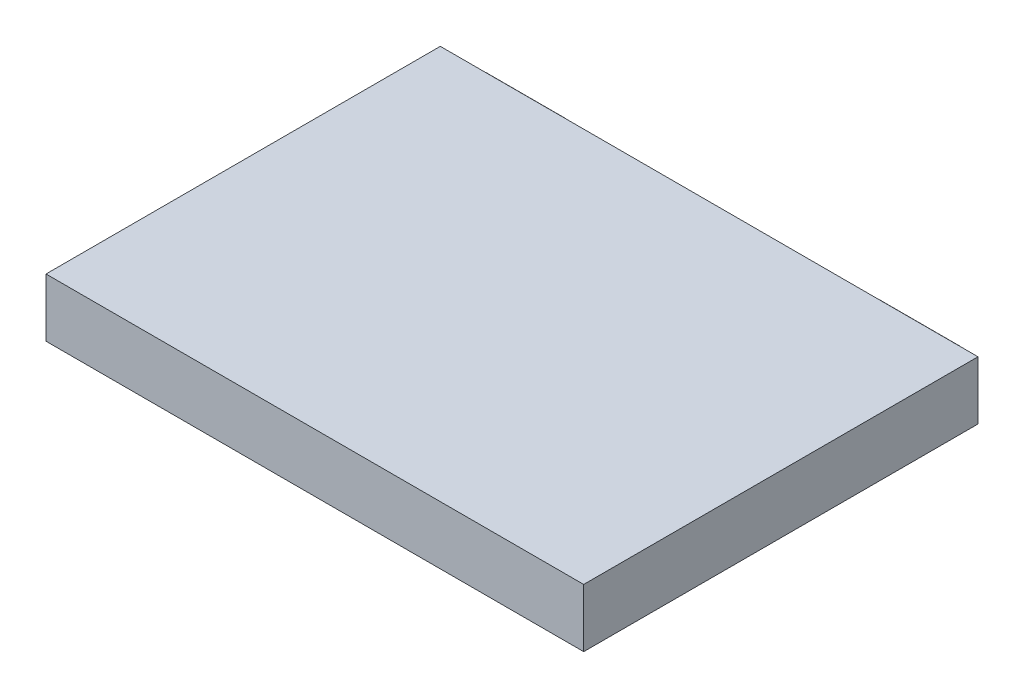
ISO-10303-21;
HEADER;
FILE_DESCRIPTION(('STEP AP214'),'2;1');
FILE_NAME('part.step','',(''),(''),'','','');
FILE_SCHEMA(('AUTOMOTIVE_DESIGN { 1 0 10303 214 1 1 1 1 }'));
ENDSEC;
DATA;
#1=APPLICATION_CONTEXT('core data for automotive mechanical design processes');
#2=APPLICATION_PROTOCOL_DEFINITION('international standard','automotive_design',2000,#1);
#3=PRODUCT_CONTEXT('',#1,'mechanical');
#4=PRODUCT('Part','Part','',(#3));
#5=PRODUCT_RELATED_PRODUCT_CATEGORY('part','',(#4));
#6=PRODUCT_DEFINITION_FORMATION('','',#4);
#7=PRODUCT_DEFINITION_CONTEXT('part definition',#1,'design');
#8=PRODUCT_DEFINITION('design','',#6,#7);
#9=PRODUCT_DEFINITION_SHAPE('','',#8);
#10=(LENGTH_UNIT() NAMED_UNIT(*) SI_UNIT(.MILLI.,.METRE.));
#11=(NAMED_UNIT(*) PLANE_ANGLE_UNIT() SI_UNIT($,.RADIAN.));
#12=(NAMED_UNIT(*) SI_UNIT($,.STERADIAN.) SOLID_ANGLE_UNIT());
#13=UNCERTAINTY_MEASURE_WITH_UNIT(LENGTH_MEASURE(1.E-05),#10,'distance_accuracy_value','');
#14=(GEOMETRIC_REPRESENTATION_CONTEXT(3) GLOBAL_UNCERTAINTY_ASSIGNED_CONTEXT((#13)) GLOBAL_UNIT_ASSIGNED_CONTEXT((#10,
#11,#12)) REPRESENTATION_CONTEXT('',''));
#15=CARTESIAN_POINT('',(0.,0.,0.));
#16=DIRECTION('',(0.,0.,1.));
#17=DIRECTION('',(1.,0.,0.));
#18=AXIS2_PLACEMENT_3D('',#15,#16,#17);
#19=CARTESIAN_POINT('',(60.,13.,-44.));
#20=DIRECTION('',(-1.,0.,0.));
#21=DIRECTION('',(0.,0.,1.));
#22=AXIS2_PLACEMENT_3D('',#19,#20,#21);
#23=PLANE('',#22);
#24=DIRECTION('',(0.,0.,-1.));
#25=VECTOR('',#24,1.);
#26=CARTESIAN_POINT('',(60.,0.,-44.));
#27=LINE('',#26,#25);
#28=CARTESIAN_POINT('',(60.,0.,44.));
#29=VERTEX_POINT('',#28);
#30=CARTESIAN_POINT('',(60.,0.,-44.));
#31=VERTEX_POINT('',#30);
#32=EDGE_CURVE('E195',#29,#31,#27,.T.);
#33=ORIENTED_EDGE('',*,*,#32,.T.);
#34=DIRECTION('',(0.,-1.,0.));
#35=VECTOR('',#34,1.);
#36=CARTESIAN_POINT('',(60.,13.,-44.));
#37=LINE('',#36,#35);
#38=CARTESIAN_POINT('',(60.,13.,-44.));
#39=VERTEX_POINT('',#38);
#40=EDGE_CURVE('E11',#39,#31,#37,.T.);
#41=ORIENTED_EDGE('',*,*,#40,.F.);
#42=DIRECTION('',(0.,0.,-1.));
#43=VECTOR('',#42,1.);
#44=CARTESIAN_POINT('',(60.,13.,-44.));
#45=LINE('',#44,#43);
#46=CARTESIAN_POINT('',(60.,13.,44.));
#47=VERTEX_POINT('',#46);
#48=EDGE_CURVE('E196',#47,#39,#45,.T.);
#49=ORIENTED_EDGE('',*,*,#48,.F.);
#50=DIRECTION('',(0.,-1.,0.));
#51=VECTOR('',#50,1.);
#52=CARTESIAN_POINT('',(60.,13.,44.));
#53=LINE('',#52,#51);
#54=EDGE_CURVE('E206',#47,#29,#53,.T.);
#55=ORIENTED_EDGE('',*,*,#54,.T.);
#56=EDGE_LOOP('',(#33,#41,#49,#55));
#57=FACE_BOUND('',#56,.T.);
#58=ADVANCED_FACE('F37',(#57),#23,.F.);
#59=CARTESIAN_POINT('',(-60.,13.,-44.));
#60=DIRECTION('',(0.,0.,1.));
#61=DIRECTION('',(1.,0.,0.));
#62=AXIS2_PLACEMENT_3D('',#59,#60,#61);
#63=PLANE('',#62);
#64=DIRECTION('',(1.,0.,0.));
#65=VECTOR('',#64,1.);
#66=CARTESIAN_POINT('',(0.,10.0368341750979,-44.));
#67=LINE('',#66,#65);
#68=CARTESIAN_POINT('',(-52.87689989644,10.0368341750977,-44.));
#69=VERTEX_POINT('',#68);
#70=CARTESIAN_POINT('',(-35.12310010356,10.0368341750977,-44.));
#71=VERTEX_POINT('',#70);
#72=EDGE_CURVE('E159',#69,#71,#67,.T.);
#73=ORIENTED_EDGE('',*,*,#72,.F.);
#74=DIRECTION('',(0.,-1.,0.));
#75=VECTOR('',#74,1.);
#76=CARTESIAN_POINT('',(-52.87689989644,-2.41637953996677E-13,-44.));
#77=LINE('',#76,#75);
#78=CARTESIAN_POINT('',(-52.87689989644,3.96316582490187,-44.));
#79=VERTEX_POINT('',#78);
#80=EDGE_CURVE('E134',#69,#79,#77,.T.);
#81=ORIENTED_EDGE('',*,*,#80,.T.);
#82=DIRECTION('',(1.,0.,0.));
#83=VECTOR('',#82,1.);
#84=CARTESIAN_POINT('',(0.,3.9631658249021,-44.));
#85=LINE('',#84,#83);
#86=CARTESIAN_POINT('',(-35.12310010356,3.96316582490195,-44.));
#87=VERTEX_POINT('',#86);
#88=EDGE_CURVE('E150',#79,#87,#85,.T.);
#89=ORIENTED_EDGE('',*,*,#88,.T.);
#90=DIRECTION('',(0.,-1.,0.));
#91=VECTOR('',#90,1.);
#92=CARTESIAN_POINT('',(-35.12310010356,-1.60506271427915E-13,-44.));
#93=LINE('',#92,#91);
#94=EDGE_CURVE('E51',#71,#87,#93,.T.);
#95=ORIENTED_EDGE('',*,*,#94,.F.);
#96=EDGE_LOOP('',(#73,#81,#89,#95));
#97=FACE_BOUND('',#96,.T.);
#98=DIRECTION('',(-1.,0.,0.));
#99=VECTOR('',#98,1.);
#100=CARTESIAN_POINT('',(0.,10.0368341750979,-44.));
#101=LINE('',#100,#99);
#102=CARTESIAN_POINT('',(52.87689989644,10.0368341750979,-44.));
#103=VERTEX_POINT('',#102);
#104=CARTESIAN_POINT('',(35.12310010356,10.0368341750979,-44.));
#105=VERTEX_POINT('',#104);
#106=EDGE_CURVE('E59',#103,#105,#101,.T.);
#107=ORIENTED_EDGE('',*,*,#106,.T.);
#108=DIRECTION('',(0.,-1.,0.));
#109=VECTOR('',#108,1.);
#110=CARTESIAN_POINT('',(35.12310010356,0.,-44.));
#111=LINE('',#110,#109);
#112=CARTESIAN_POINT('',(35.12310010356,3.9631658249021,-44.));
#113=VERTEX_POINT('',#112);
#114=EDGE_CURVE('E137',#105,#113,#111,.T.);
#115=ORIENTED_EDGE('',*,*,#114,.T.);
#116=DIRECTION('',(-1.,0.,0.));
#117=VECTOR('',#116,1.);
#118=CARTESIAN_POINT('',(0.,3.9631658249021,-44.));
#119=LINE('',#118,#117);
#120=CARTESIAN_POINT('',(52.87689989644,3.9631658249021,-44.));
#121=VERTEX_POINT('',#120);
#122=EDGE_CURVE('E170',#121,#113,#119,.T.);
#123=ORIENTED_EDGE('',*,*,#122,.F.);
#124=DIRECTION('',(0.,-1.,0.));
#125=VECTOR('',#124,1.);
#126=CARTESIAN_POINT('',(52.87689989644,0.,-44.));
#127=LINE('',#126,#125);
#128=EDGE_CURVE('E180',#103,#121,#127,.T.);
#129=ORIENTED_EDGE('',*,*,#128,.F.);
#130=EDGE_LOOP('',(#107,#115,#123,#129));
#131=FACE_BOUND('',#130,.T.);
#132=DIRECTION('',(-1.,0.,0.));
#133=VECTOR('',#132,1.);
#134=CARTESIAN_POINT('',(-60.,0.,-44.));
#135=LINE('',#134,#133);
#136=CARTESIAN_POINT('',(-60.,0.,-44.));
#137=VERTEX_POINT('',#136);
#138=EDGE_CURVE('E209',#31,#137,#135,.T.);
#139=ORIENTED_EDGE('',*,*,#138,.T.);
#140=DIRECTION('',(0.,-1.,0.));
#141=VECTOR('',#140,1.);
#142=CARTESIAN_POINT('',(-60.,13.,-44.));
#143=LINE('',#142,#141);
#144=CARTESIAN_POINT('',(-60.,13.,-44.));
#145=VERTEX_POINT('',#144);
#146=EDGE_CURVE('E44',#145,#137,#143,.T.);
#147=ORIENTED_EDGE('',*,*,#146,.F.);
#148=DIRECTION('',(-1.,0.,0.));
#149=VECTOR('',#148,1.);
#150=CARTESIAN_POINT('',(-60.,13.,-44.));
#151=LINE('',#150,#149);
#152=EDGE_CURVE('E199',#39,#145,#151,.T.);
#153=ORIENTED_EDGE('',*,*,#152,.F.);
#154=ORIENTED_EDGE('',*,*,#40,.T.);
#155=EDGE_LOOP('',(#139,#147,#153,#154));
#156=FACE_BOUND('',#155,.T.);
#157=ADVANCED_FACE('F239',(#97,#131,#156),#63,.F.);
#158=CARTESIAN_POINT('',(-60.,13.,-44.));
#159=DIRECTION('',(1.,0.,0.));
#160=DIRECTION('',(0.,0.,-1.));
#161=AXIS2_PLACEMENT_3D('',#158,#159,#160);
#162=PLANE('',#161);
#163=DIRECTION('',(0.,0.,1.));
#164=VECTOR('',#163,1.);
#165=CARTESIAN_POINT('',(-60.,0.,-44.));
#166=LINE('',#165,#164);
#167=CARTESIAN_POINT('',(-60.,0.,44.));
#168=VERTEX_POINT('',#167);
#169=EDGE_CURVE('E211',#137,#168,#166,.T.);
#170=ORIENTED_EDGE('',*,*,#169,.T.);
#171=DIRECTION('',(0.,-1.,0.));
#172=VECTOR('',#171,1.);
#173=CARTESIAN_POINT('',(-60.,13.,44.));
#174=LINE('',#173,#172);
#175=CARTESIAN_POINT('',(-60.,13.,44.));
#176=VERTEX_POINT('',#175);
#177=EDGE_CURVE('E216',#176,#168,#174,.T.);
#178=ORIENTED_EDGE('',*,*,#177,.F.);
#179=DIRECTION('',(0.,0.,1.));
#180=VECTOR('',#179,1.);
#181=CARTESIAN_POINT('',(-60.,13.,-44.));
#182=LINE('',#181,#180);
#183=EDGE_CURVE('E202',#145,#176,#182,.T.);
#184=ORIENTED_EDGE('',*,*,#183,.F.);
#185=ORIENTED_EDGE('',*,*,#146,.T.);
#186=EDGE_LOOP('',(#170,#178,#184,#185));
#187=FACE_BOUND('',#186,.T.);
#188=ADVANCED_FACE('F223',(#187),#162,.F.);
#189=CARTESIAN_POINT('',(-60.,13.,44.));
#190=DIRECTION('',(0.,0.,-1.));
#191=DIRECTION('',(-1.,0.,0.));
#192=AXIS2_PLACEMENT_3D('',#189,#190,#191);
#193=PLANE('',#192);
#194=DIRECTION('',(1.,0.,0.));
#195=VECTOR('',#194,1.);
#196=CARTESIAN_POINT('',(-60.,0.,44.));
#197=LINE('',#196,#195);
#198=EDGE_CURVE('E200',#168,#29,#197,.T.);
#199=ORIENTED_EDGE('',*,*,#198,.T.);
#200=ORIENTED_EDGE('',*,*,#54,.F.);
#201=DIRECTION('',(1.,0.,0.));
#202=VECTOR('',#201,1.);
#203=CARTESIAN_POINT('',(-60.,13.,44.));
#204=LINE('',#203,#202);
#205=EDGE_CURVE('E204',#176,#47,#204,.T.);
#206=ORIENTED_EDGE('',*,*,#205,.F.);
#207=ORIENTED_EDGE('',*,*,#177,.T.);
#208=EDGE_LOOP('',(#199,#200,#206,#207));
#209=FACE_BOUND('',#208,.T.);
#210=ADVANCED_FACE('F232',(#209),#193,.F.);
#211=CARTESIAN_POINT('',(0.,13.,0.));
#212=DIRECTION('',(0.,1.,0.));
#213=DIRECTION('',(0.,0.,1.));
#214=AXIS2_PLACEMENT_3D('',#211,#212,#213);
#215=PLANE('',#214);
#216=ORIENTED_EDGE('',*,*,#48,.T.);
#217=ORIENTED_EDGE('',*,*,#152,.T.);
#218=ORIENTED_EDGE('',*,*,#183,.T.);
#219=ORIENTED_EDGE('',*,*,#205,.T.);
#220=EDGE_LOOP('',(#216,#217,#218,#219));
#221=FACE_BOUND('',#220,.T.);
#222=ADVANCED_FACE('F238',(#221),#215,.T.);
#223=CARTESIAN_POINT('',(0.,0.,0.));
#224=DIRECTION('',(0.,1.,0.));
#225=DIRECTION('',(0.,0.,1.));
#226=AXIS2_PLACEMENT_3D('',#223,#224,#225);
#227=PLANE('',#226);
#228=ORIENTED_EDGE('',*,*,#32,.F.);
#229=ORIENTED_EDGE('',*,*,#198,.F.);
#230=ORIENTED_EDGE('',*,*,#169,.F.);
#231=ORIENTED_EDGE('',*,*,#138,.F.);
#232=EDGE_LOOP('',(#228,#229,#230,#231));
#233=FACE_BOUND('',#232,.T.);
#234=ADVANCED_FACE('F229',(#233),#227,.F.);
#235=CARTESIAN_POINT('',(35.12310010356,0.,-47.));
#236=DIRECTION('',(-1.,0.,0.));
#237=DIRECTION('',(0.,0.,1.));
#238=AXIS2_PLACEMENT_3D('',#235,#236,#237);
#239=PLANE('',#238);
#240=ORIENTED_EDGE('',*,*,#114,.F.);
#241=DIRECTION('',(0.,0.,1.));
#242=VECTOR('',#241,1.);
#243=CARTESIAN_POINT('',(35.12310010356,10.0368341750979,-47.));
#244=LINE('',#243,#242);
#245=CARTESIAN_POINT('',(35.12310010356,10.0368341750979,-47.));
#246=VERTEX_POINT('',#245);
#247=EDGE_CURVE('E193',#246,#105,#244,.T.);
#248=ORIENTED_EDGE('',*,*,#247,.F.);
#249=DIRECTION('',(0.,-1.,0.));
#250=VECTOR('',#249,1.);
#251=CARTESIAN_POINT('',(35.12310010356,0.,-47.));
#252=LINE('',#251,#250);
#253=CARTESIAN_POINT('',(35.12310010356,3.9631658249021,-47.));
#254=VERTEX_POINT('',#253);
#255=EDGE_CURVE('E166',#246,#254,#252,.T.);
#256=ORIENTED_EDGE('',*,*,#255,.T.);
#257=DIRECTION('',(0.,0.,1.));
#258=VECTOR('',#257,1.);
#259=CARTESIAN_POINT('',(35.12310010356,3.9631658249021,-47.));
#260=LINE('',#259,#258);
#261=EDGE_CURVE('E177',#254,#113,#260,.T.);
#262=ORIENTED_EDGE('',*,*,#261,.T.);
#263=EDGE_LOOP('',(#240,#248,#256,#262));
#264=FACE_BOUND('',#263,.T.);
#265=ADVANCED_FACE('F252',(#264),#239,.T.);
#266=CARTESIAN_POINT('',(0.,10.0368341750979,-47.));
#267=DIRECTION('',(0.,1.,0.));
#268=DIRECTION('',(0.,0.,1.));
#269=AXIS2_PLACEMENT_3D('',#266,#267,#268);
#270=PLANE('',#269);
#271=ORIENTED_EDGE('',*,*,#106,.F.);
#272=DIRECTION('',(0.,0.,1.));
#273=VECTOR('',#272,1.);
#274=CARTESIAN_POINT('',(52.87689989644,10.0368341750979,-47.));
#275=LINE('',#274,#273);
#276=CARTESIAN_POINT('',(52.87689989644,10.0368341750979,-47.));
#277=VERTEX_POINT('',#276);
#278=EDGE_CURVE('E190',#277,#103,#275,.T.);
#279=ORIENTED_EDGE('',*,*,#278,.F.);
#280=DIRECTION('',(-1.,0.,0.));
#281=VECTOR('',#280,1.);
#282=CARTESIAN_POINT('',(0.,10.0368341750979,-47.));
#283=LINE('',#282,#281);
#284=EDGE_CURVE('E169',#277,#246,#283,.T.);
#285=ORIENTED_EDGE('',*,*,#284,.T.);
#286=ORIENTED_EDGE('',*,*,#247,.T.);
#287=EDGE_LOOP('',(#271,#279,#285,#286));
#288=FACE_BOUND('',#287,.T.);
#289=ADVANCED_FACE('F257',(#288),#270,.T.);
#290=CARTESIAN_POINT('',(52.87689989644,0.,-47.));
#291=DIRECTION('',(-1.,0.,0.));
#292=DIRECTION('',(0.,0.,1.));
#293=AXIS2_PLACEMENT_3D('',#290,#291,#292);
#294=PLANE('',#293);
#295=ORIENTED_EDGE('',*,*,#128,.T.);
#296=DIRECTION('',(0.,0.,1.));
#297=VECTOR('',#296,1.);
#298=CARTESIAN_POINT('',(52.87689989644,3.9631658249021,-47.));
#299=LINE('',#298,#297);
#300=CARTESIAN_POINT('',(52.87689989644,3.9631658249021,-47.));
#301=VERTEX_POINT('',#300);
#302=EDGE_CURVE('E187',#301,#121,#299,.T.);
#303=ORIENTED_EDGE('',*,*,#302,.F.);
#304=DIRECTION('',(0.,-1.,0.));
#305=VECTOR('',#304,1.);
#306=CARTESIAN_POINT('',(52.87689989644,0.,-47.));
#307=LINE('',#306,#305);
#308=EDGE_CURVE('E173',#277,#301,#307,.T.);
#309=ORIENTED_EDGE('',*,*,#308,.F.);
#310=ORIENTED_EDGE('',*,*,#278,.T.);
#311=EDGE_LOOP('',(#295,#303,#309,#310));
#312=FACE_BOUND('',#311,.T.);
#313=ADVANCED_FACE('F261',(#312),#294,.F.);
#314=CARTESIAN_POINT('',(0.,3.9631658249021,-47.));
#315=DIRECTION('',(0.,1.,0.));
#316=DIRECTION('',(0.,0.,1.));
#317=AXIS2_PLACEMENT_3D('',#314,#315,#316);
#318=PLANE('',#317);
#319=ORIENTED_EDGE('',*,*,#122,.T.);
#320=ORIENTED_EDGE('',*,*,#261,.F.);
#321=DIRECTION('',(-1.,0.,0.));
#322=VECTOR('',#321,1.);
#323=CARTESIAN_POINT('',(0.,3.9631658249021,-47.));
#324=LINE('',#323,#322);
#325=EDGE_CURVE('E175',#301,#254,#324,.T.);
#326=ORIENTED_EDGE('',*,*,#325,.F.);
#327=ORIENTED_EDGE('',*,*,#302,.T.);
#328=EDGE_LOOP('',(#319,#320,#326,#327));
#329=FACE_BOUND('',#328,.T.);
#330=ADVANCED_FACE('F265',(#329),#318,.F.);
#331=CARTESIAN_POINT('',(0.,0.,-47.));
#332=DIRECTION('',(0.,0.,-1.));
#333=DIRECTION('',(-1.,0.,0.));
#334=AXIS2_PLACEMENT_3D('',#331,#332,#333);
#335=PLANE('',#334);
#336=ORIENTED_EDGE('',*,*,#255,.F.);
#337=ORIENTED_EDGE('',*,*,#284,.F.);
#338=ORIENTED_EDGE('',*,*,#308,.T.);
#339=ORIENTED_EDGE('',*,*,#325,.T.);
#340=EDGE_LOOP('',(#336,#337,#338,#339));
#341=FACE_BOUND('',#340,.T.);
#342=ADVANCED_FACE('F269',(#341),#335,.T.);
#343=CARTESIAN_POINT('',(-52.87689989644,-2.41637953996677E-13,-47.));
#344=DIRECTION('',(-1.,0.,0.));
#345=DIRECTION('',(0.,-1.,0.));
#346=AXIS2_PLACEMENT_3D('',#343,#344,#345);
#347=PLANE('',#346);
#348=ORIENTED_EDGE('',*,*,#80,.F.);
#349=DIRECTION('',(0.,0.,1.));
#350=VECTOR('',#349,1.);
#351=CARTESIAN_POINT('',(-52.87689989644,10.0368341750977,-47.));
#352=LINE('',#351,#350);
#353=CARTESIAN_POINT('',(-52.87689989644,10.0368341750977,-47.));
#354=VERTEX_POINT('',#353);
#355=EDGE_CURVE('E127',#354,#69,#352,.T.);
#356=ORIENTED_EDGE('',*,*,#355,.F.);
#357=DIRECTION('',(0.,-1.,0.));
#358=VECTOR('',#357,1.);
#359=CARTESIAN_POINT('',(-52.87689989644,-2.41637953996677E-13,-47.));
#360=LINE('',#359,#358);
#361=CARTESIAN_POINT('',(-52.87689989644,3.96316582490187,-47.));
#362=VERTEX_POINT('',#361);
#363=EDGE_CURVE('E131',#354,#362,#360,.T.);
#364=ORIENTED_EDGE('',*,*,#363,.T.);
#365=DIRECTION('',(0.,0.,1.));
#366=VECTOR('',#365,1.);
#367=CARTESIAN_POINT('',(-52.87689989644,3.96316582490187,-47.));
#368=LINE('',#367,#366);
#369=EDGE_CURVE('E157',#362,#79,#368,.T.);
#370=ORIENTED_EDGE('',*,*,#369,.T.);
#371=EDGE_LOOP('',(#348,#356,#364,#370));
#372=FACE_BOUND('',#371,.T.);
#373=ADVANCED_FACE('F129',(#372),#347,.T.);
#374=CARTESIAN_POINT('',(0.,10.0368341750979,-47.));
#375=DIRECTION('',(0.,-1.,0.));
#376=DIRECTION('',(1.,0.,0.));
#377=AXIS2_PLACEMENT_3D('',#374,#375,#376);
#378=PLANE('',#377);
#379=ORIENTED_EDGE('',*,*,#72,.T.);
#380=DIRECTION('',(0.,0.,1.));
#381=VECTOR('',#380,1.);
#382=CARTESIAN_POINT('',(-35.12310010356,10.0368341750977,-47.));
#383=LINE('',#382,#381);
#384=CARTESIAN_POINT('',(-35.12310010356,10.0368341750977,-47.));
#385=VERTEX_POINT('',#384);
#386=EDGE_CURVE('E138',#385,#71,#383,.T.);
#387=ORIENTED_EDGE('',*,*,#386,.F.);
#388=DIRECTION('',(1.,0.,0.));
#389=VECTOR('',#388,1.);
#390=CARTESIAN_POINT('',(0.,10.0368341750979,-47.));
#391=LINE('',#390,#389);
#392=EDGE_CURVE('E141',#354,#385,#391,.T.);
#393=ORIENTED_EDGE('',*,*,#392,.F.);
#394=ORIENTED_EDGE('',*,*,#355,.T.);
#395=EDGE_LOOP('',(#379,#387,#393,#394));
#396=FACE_BOUND('',#395,.T.);
#397=ADVANCED_FACE('F142',(#396),#378,.F.);
#398=CARTESIAN_POINT('',(-35.12310010356,-1.60506271427915E-13,-47.));
#399=DIRECTION('',(-1.,0.,0.));
#400=DIRECTION('',(0.,-1.,0.));
#401=AXIS2_PLACEMENT_3D('',#398,#399,#400);
#402=PLANE('',#401);
#403=ORIENTED_EDGE('',*,*,#94,.T.);
#404=DIRECTION('',(0.,0.,1.));
#405=VECTOR('',#404,1.);
#406=CARTESIAN_POINT('',(-35.12310010356,3.96316582490195,-47.));
#407=LINE('',#406,#405);
#408=CARTESIAN_POINT('',(-35.12310010356,3.96316582490195,-47.));
#409=VERTEX_POINT('',#408);
#410=EDGE_CURVE('E163',#409,#87,#407,.T.);
#411=ORIENTED_EDGE('',*,*,#410,.F.);
#412=DIRECTION('',(0.,-1.,0.));
#413=VECTOR('',#412,1.);
#414=CARTESIAN_POINT('',(-35.12310010356,-1.60506271427915E-13,-47.));
#415=LINE('',#414,#413);
#416=EDGE_CURVE('E145',#385,#409,#415,.T.);
#417=ORIENTED_EDGE('',*,*,#416,.F.);
#418=ORIENTED_EDGE('',*,*,#386,.T.);
#419=EDGE_LOOP('',(#403,#411,#417,#418));
#420=FACE_BOUND('',#419,.T.);
#421=ADVANCED_FACE('F278',(#420),#402,.F.);
#422=CARTESIAN_POINT('',(0.,3.9631658249021,-47.));
#423=DIRECTION('',(0.,-1.,0.));
#424=DIRECTION('',(1.,0.,0.));
#425=AXIS2_PLACEMENT_3D('',#422,#423,#424);
#426=PLANE('',#425);
#427=ORIENTED_EDGE('',*,*,#88,.F.);
#428=ORIENTED_EDGE('',*,*,#369,.F.);
#429=DIRECTION('',(1.,0.,0.));
#430=VECTOR('',#429,1.);
#431=CARTESIAN_POINT('',(0.,3.9631658249021,-47.));
#432=LINE('',#431,#430);
#433=EDGE_CURVE('E149',#362,#409,#432,.T.);
#434=ORIENTED_EDGE('',*,*,#433,.T.);
#435=ORIENTED_EDGE('',*,*,#410,.T.);
#436=EDGE_LOOP('',(#427,#428,#434,#435));
#437=FACE_BOUND('',#436,.T.);
#438=ADVANCED_FACE('F281',(#437),#426,.T.);
#439=CARTESIAN_POINT('',(0.,0.,-47.));
#440=DIRECTION('',(0.,0.,-1.));
#441=DIRECTION('',(-1.,0.,0.));
#442=AXIS2_PLACEMENT_3D('',#439,#440,#441);
#443=PLANE('',#442);
#444=ORIENTED_EDGE('',*,*,#363,.F.);
#445=ORIENTED_EDGE('',*,*,#392,.T.);
#446=ORIENTED_EDGE('',*,*,#416,.T.);
#447=ORIENTED_EDGE('',*,*,#433,.F.);
#448=EDGE_LOOP('',(#444,#445,#446,#447));
#449=FACE_BOUND('',#448,.T.);
#450=ADVANCED_FACE('F147',(#449),#443,.T.);
#451=CLOSED_SHELL('',(#58,#157,#188,#210,#222,#234,#265,#289,#313,#330,#342,#373,#397,#421,#438,#450));
#452=MANIFOLD_SOLID_BREP('B2',#451);
#453=ADVANCED_BREP_SHAPE_REPRESENTATION('',(#18,#452),#14);
#454=SHAPE_DEFINITION_REPRESENTATION(#9,#453);
ENDSEC;
END-ISO-10303-21;
